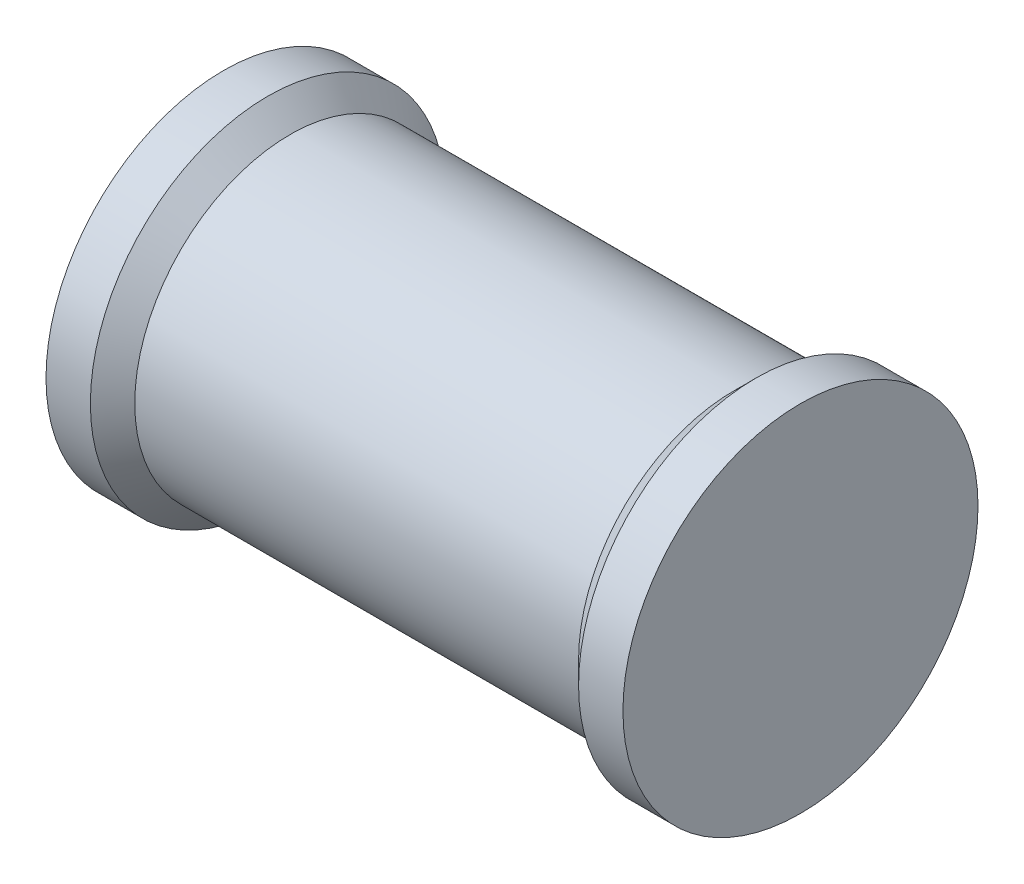
ISO-10303-21;
HEADER;
FILE_DESCRIPTION(('STEP AP214'),'2;1');
FILE_NAME('part.step','',(''),(''),'','','');
FILE_SCHEMA(('AUTOMOTIVE_DESIGN { 1 0 10303 214 1 1 1 1 }'));
ENDSEC;
DATA;
#1=APPLICATION_CONTEXT('core data for automotive mechanical design processes');
#2=APPLICATION_PROTOCOL_DEFINITION('international standard','automotive_design',2000,#1);
#3=PRODUCT_CONTEXT('',#1,'mechanical');
#4=PRODUCT('Part','Part','',(#3));
#5=PRODUCT_RELATED_PRODUCT_CATEGORY('part','',(#4));
#6=PRODUCT_DEFINITION_FORMATION('','',#4);
#7=PRODUCT_DEFINITION_CONTEXT('part definition',#1,'design');
#8=PRODUCT_DEFINITION('design','',#6,#7);
#9=PRODUCT_DEFINITION_SHAPE('','',#8);
#10=(LENGTH_UNIT() NAMED_UNIT(*) SI_UNIT(.MILLI.,.METRE.));
#11=(NAMED_UNIT(*) PLANE_ANGLE_UNIT() SI_UNIT($,.RADIAN.));
#12=(NAMED_UNIT(*) SI_UNIT($,.STERADIAN.) SOLID_ANGLE_UNIT());
#13=UNCERTAINTY_MEASURE_WITH_UNIT(LENGTH_MEASURE(1.E-05),#10,'distance_accuracy_value','');
#14=(GEOMETRIC_REPRESENTATION_CONTEXT(3) GLOBAL_UNCERTAINTY_ASSIGNED_CONTEXT((#13)) GLOBAL_UNIT_ASSIGNED_CONTEXT((#10,
#11,#12)) REPRESENTATION_CONTEXT('',''));
#15=CARTESIAN_POINT('',(0.,0.,0.));
#16=DIRECTION('',(0.,0.,1.));
#17=DIRECTION('',(1.,0.,0.));
#18=AXIS2_PLACEMENT_3D('',#15,#16,#17);
#19=CARTESIAN_POINT('',(13.,-56.8831883779294,16.9708688474058));
#20=DIRECTION('',(-1.,0.,0.));
#21=DIRECTION('',(0.,0.,1.));
#22=AXIS2_PLACEMENT_3D('',#19,#20,#21);
#23=PLANE('',#22);
#24=CARTESIAN_POINT('',(13.,-56.5345654069388,20.9556476397727));
#25=DIRECTION('',(-1.,0.,0.));
#26=DIRECTION('',(0.,0.,1.));
#27=AXIS2_PLACEMENT_3D('',#24,#25,#26);
#28=CIRCLE('',#27,2.2);
#29=CARTESIAN_POINT('',(13.,-56.5345654069388,23.1556476397727));
#30=VERTEX_POINT('',#29);
#31=EDGE_CURVE('E171',#30,#30,#28,.T.);
#32=ORIENTED_EDGE('',*,*,#31,.F.);
#33=EDGE_LOOP('',(#32));
#34=FACE_BOUND('',#33,.T.);
#35=CARTESIAN_POINT('',(13.,-56.5345654069388,20.9556476397728));
#36=DIRECTION('',(-1.,0.,0.));
#37=DIRECTION('',(0.,0.,1.));
#38=AXIS2_PLACEMENT_3D('',#35,#36,#37);
#39=CIRCLE('',#38,4.);
#40=CARTESIAN_POINT('',(13.,-56.5345654069388,24.9556476397728));
#41=VERTEX_POINT('',#40);
#42=EDGE_CURVE('E111',#41,#41,#39,.T.);
#43=ORIENTED_EDGE('',*,*,#42,.T.);
#44=EDGE_LOOP('',(#43));
#45=FACE_BOUND('',#44,.T.);
#46=ADVANCED_FACE('F41',(#34,#45),#23,.T.);
#47=CARTESIAN_POINT('',(26.,-56.5345654069388,20.9556476397728));
#48=DIRECTION('',(1.,0.,0.));
#49=DIRECTION('',(0.,0.,-1.));
#50=AXIS2_PLACEMENT_3D('',#47,#48,#49);
#51=PLANE('',#50);
#52=CARTESIAN_POINT('',(26.,-56.5345654069388,20.9556476397728));
#53=DIRECTION('',(-1.,0.,0.));
#54=DIRECTION('',(0.,0.,1.));
#55=AXIS2_PLACEMENT_3D('',#52,#53,#54);
#56=CIRCLE('',#55,4.);
#57=CARTESIAN_POINT('',(26.,-56.5345654069388,24.9556476397728));
#58=VERTEX_POINT('',#57);
#59=EDGE_CURVE('E128',#58,#58,#56,.T.);
#60=ORIENTED_EDGE('',*,*,#59,.F.);
#61=EDGE_LOOP('',(#60));
#62=FACE_BOUND('',#61,.T.);
#63=ADVANCED_FACE('F161',(#62),#51,.T.);
#64=CARTESIAN_POINT('',(13.,-56.5345654069388,20.9556476397728));
#65=DIRECTION('',(-1.,0.,0.));
#66=DIRECTION('',(0.,0.,1.));
#67=AXIS2_PLACEMENT_3D('',#64,#65,#66);
#68=CYLINDRICAL_SURFACE('',#67,4.);
#69=ORIENTED_EDGE('',*,*,#59,.T.);
#70=EDGE_LOOP('',(#69));
#71=FACE_BOUND('',#70,.T.);
#72=CARTESIAN_POINT('',(25.,-56.5345654069388,20.9556476397728));
#73=DIRECTION('',(-1.,0.,0.));
#74=DIRECTION('',(0.,0.,1.));
#75=AXIS2_PLACEMENT_3D('',#72,#73,#74);
#76=CIRCLE('',#75,4.);
#77=CARTESIAN_POINT('',(25.,-56.5345654069388,24.9556476397728));
#78=VERTEX_POINT('',#77);
#79=EDGE_CURVE('E125',#78,#78,#76,.T.);
#80=ORIENTED_EDGE('',*,*,#79,.F.);
#81=EDGE_LOOP('',(#80));
#82=FACE_BOUND('',#81,.T.);
#83=ADVANCED_FACE('F167',(#71,#82),#68,.T.);
#84=CARTESIAN_POINT('',(24.5,-56.5345654069388,20.9556476397728));
#85=DIRECTION('',(1.,0.,0.));
#86=DIRECTION('',(0.,0.,-1.));
#87=AXIS2_PLACEMENT_3D('',#84,#85,#86);
#88=CONICAL_SURFACE('',#87,3.5,0.78539816339745);
#89=ORIENTED_EDGE('',*,*,#79,.T.);
#90=EDGE_LOOP('',(#89));
#91=FACE_BOUND('',#90,.T.);
#92=CARTESIAN_POINT('',(24.5,-56.5345654069388,20.9556476397728));
#93=DIRECTION('',(-1.,0.,0.));
#94=DIRECTION('',(0.,0.,1.));
#95=AXIS2_PLACEMENT_3D('',#92,#93,#94);
#96=CIRCLE('',#95,3.5);
#97=CARTESIAN_POINT('',(24.5,-56.5345654069388,24.4556476397728));
#98=VERTEX_POINT('',#97);
#99=EDGE_CURVE('E122',#98,#98,#96,.T.);
#100=ORIENTED_EDGE('',*,*,#99,.F.);
#101=EDGE_LOOP('',(#100));
#102=FACE_BOUND('',#101,.T.);
#103=ADVANCED_FACE('F143',(#91,#102),#88,.T.);
#104=CARTESIAN_POINT('',(13.,-56.5345654069388,20.9556476397728));
#105=DIRECTION('',(-1.,0.,0.));
#106=DIRECTION('',(0.,0.,1.));
#107=AXIS2_PLACEMENT_3D('',#104,#105,#106);
#108=CYLINDRICAL_SURFACE('',#107,3.5);
#109=DIRECTION('',(-1.,0.,0.));
#110=VECTOR('',#109,1.);
#111=CARTESIAN_POINT('',(13.,-54.6865926206395,17.9832754253458));
#112=LINE('',#111,#110);
#113=CARTESIAN_POINT('',(16.9,-54.6865926206395,17.9832754253458));
#114=VERTEX_POINT('',#113);
#115=CARTESIAN_POINT('',(19.9,-54.6865926206395,17.9832754253458));
#116=VERTEX_POINT('',#115);
#117=EDGE_CURVE('E11',#114,#116,#112,.F.);
#118=ORIENTED_EDGE('',*,*,#117,.F.);
#119=CARTESIAN_POINT('',(16.9,-56.5345654069388,20.9556476397728));
#120=DIRECTION('',(-1.,0.,0.));
#121=DIRECTION('',(0.,0.,1.));
#122=AXIS2_PLACEMENT_3D('',#119,#120,#121);
#123=CIRCLE('',#122,3.5);
#124=CARTESIAN_POINT('',(16.9,-58.8706103526249,18.3493295448859));
#125=VERTEX_POINT('',#124);
#126=EDGE_CURVE('E49',#125,#114,#123,.F.);
#127=ORIENTED_EDGE('',*,*,#126,.F.);
#128=DIRECTION('',(-1.,0.,0.));
#129=VECTOR('',#128,1.);
#130=CARTESIAN_POINT('',(13.,-58.8706103526249,18.3493295448859));
#131=LINE('',#130,#129);
#132=CARTESIAN_POINT('',(19.9,-58.8706103526249,18.3493295448859));
#133=VERTEX_POINT('',#132);
#134=EDGE_CURVE('E131',#133,#125,#131,.T.);
#135=ORIENTED_EDGE('',*,*,#134,.F.);
#136=CARTESIAN_POINT('',(19.9,-56.5345654069388,20.9556476397728));
#137=DIRECTION('',(1.,0.,0.));
#138=DIRECTION('',(0.,0.,-1.));
#139=AXIS2_PLACEMENT_3D('',#136,#137,#138);
#140=CIRCLE('',#139,3.5);
#141=EDGE_CURVE('E94',#116,#133,#140,.F.);
#142=ORIENTED_EDGE('',*,*,#141,.F.);
#143=EDGE_LOOP('',(#118,#127,#135,#142));
#144=FACE_BOUND('',#143,.T.);
#145=ORIENTED_EDGE('',*,*,#99,.T.);
#146=EDGE_LOOP('',(#145));
#147=FACE_BOUND('',#146,.T.);
#148=CARTESIAN_POINT('',(14.5,-56.5345654069388,20.9556476397728));
#149=DIRECTION('',(-1.,0.,0.));
#150=DIRECTION('',(0.,0.,1.));
#151=AXIS2_PLACEMENT_3D('',#148,#149,#150);
#152=CIRCLE('',#151,3.5);
#153=CARTESIAN_POINT('',(14.5,-56.5345654069388,24.4556476397728));
#154=VERTEX_POINT('',#153);
#155=EDGE_CURVE('E119',#154,#154,#152,.T.);
#156=ORIENTED_EDGE('',*,*,#155,.F.);
#157=EDGE_LOOP('',(#156));
#158=FACE_BOUND('',#157,.T.);
#159=ADVANCED_FACE('F139',(#144,#147,#158),#108,.T.);
#160=CARTESIAN_POINT('',(14.,-56.5345654069388,20.9556476397728));
#161=DIRECTION('',(-1.,0.,0.));
#162=DIRECTION('',(0.,0.,1.));
#163=AXIS2_PLACEMENT_3D('',#160,#161,#162);
#164=CONICAL_SURFACE('',#163,4.,0.785398163397448);
#165=ORIENTED_EDGE('',*,*,#155,.T.);
#166=EDGE_LOOP('',(#165));
#167=FACE_BOUND('',#166,.T.);
#168=CARTESIAN_POINT('',(14.,-56.5345654069388,20.9556476397728));
#169=DIRECTION('',(-1.,0.,0.));
#170=DIRECTION('',(0.,0.,1.));
#171=AXIS2_PLACEMENT_3D('',#168,#169,#170);
#172=CIRCLE('',#171,4.);
#173=CARTESIAN_POINT('',(14.,-56.5345654069388,24.9556476397728));
#174=VERTEX_POINT('',#173);
#175=EDGE_CURVE('E116',#174,#174,#172,.T.);
#176=ORIENTED_EDGE('',*,*,#175,.F.);
#177=EDGE_LOOP('',(#176));
#178=FACE_BOUND('',#177,.T.);
#179=ADVANCED_FACE('F142',(#167,#178),#164,.T.);
#180=CARTESIAN_POINT('',(13.,-56.5345654069388,20.9556476397728));
#181=DIRECTION('',(-1.,0.,0.));
#182=DIRECTION('',(0.,0.,1.));
#183=AXIS2_PLACEMENT_3D('',#180,#181,#182);
#184=CYLINDRICAL_SURFACE('',#183,4.);
#185=ORIENTED_EDGE('',*,*,#175,.T.);
#186=EDGE_LOOP('',(#185));
#187=FACE_BOUND('',#186,.T.);
#188=ORIENTED_EDGE('',*,*,#42,.F.);
#189=EDGE_LOOP('',(#188));
#190=FACE_BOUND('',#189,.T.);
#191=ADVANCED_FACE('F151',(#187,#190),#184,.T.);
#192=CARTESIAN_POINT('',(16.9,-57.9290572909012,5.01653247030481));
#193=DIRECTION('',(-1.,0.,0.));
#194=DIRECTION('',(0.,0.,1.));
#195=AXIS2_PLACEMENT_3D('',#192,#193,#194);
#196=PLANE('',#195);
#197=CARTESIAN_POINT('',(16.9,-56.5345654069388,20.9556476397727));
#198=DIRECTION('',(-1.,0.,0.));
#199=DIRECTION('',(0.,0.,1.));
#200=AXIS2_PLACEMENT_3D('',#197,#198,#199);
#201=CIRCLE('',#200,1.09999999999999);
#202=CARTESIAN_POINT('',(16.9,-56.5345654069388,22.0556476397727));
#203=VERTEX_POINT('',#202);
#204=EDGE_CURVE('E97',#203,#203,#201,.T.);
#205=ORIENTED_EDGE('',*,*,#204,.T.);
#206=EDGE_LOOP('',(#205));
#207=FACE_BOUND('',#206,.T.);
#208=ORIENTED_EDGE('',*,*,#126,.T.);
#209=DIRECTION('',(0.,0.0871557427476504,0.996194698091746));
#210=VECTOR('',#209,1.);
#211=CARTESIAN_POINT('',(16.9,-55.409985285445,9.71485943118508));
#212=LINE('',#211,#210);
#213=CARTESIAN_POINT('',(16.9,-54.4425565409461,20.7726205800027));
#214=VERTEX_POINT('',#213);
#215=EDGE_CURVE('E103',#114,#214,#212,.T.);
#216=ORIENTED_EDGE('',*,*,#215,.T.);
#217=CARTESIAN_POINT('',(16.9,-56.5345654069388,20.9556476397727));
#218=DIRECTION('',(-1.,0.,0.));
#219=DIRECTION('',(0.,0.,1.));
#220=AXIS2_PLACEMENT_3D('',#217,#218,#219);
#221=CIRCLE('',#220,2.10000000000001);
#222=CARTESIAN_POINT('',(16.9,-58.6265742729314,21.1386746995428));
#223=VERTEX_POINT('',#222);
#224=EDGE_CURVE('E87',#214,#223,#221,.F.);
#225=ORIENTED_EDGE('',*,*,#224,.T.);
#226=DIRECTION('',(0.,-0.0871557427476498,-0.996194698091746));
#227=VECTOR('',#226,1.);
#228=CARTESIAN_POINT('',(16.9,-58.6265742729314,21.1386746995428));
#229=LINE('',#228,#227);
#230=EDGE_CURVE('E82',#223,#125,#229,.T.);
#231=ORIENTED_EDGE('',*,*,#230,.T.);
#232=EDGE_LOOP('',(#208,#216,#225,#231));
#233=FACE_BOUND('',#232,.T.);
#234=ADVANCED_FACE('F136',(#207,#233),#196,.F.);
#235=CARTESIAN_POINT('',(19.9,-56.5345654069388,20.9556476397727));
#236=DIRECTION('',(1.,0.,0.));
#237=DIRECTION('',(0.,0.,-1.));
#238=AXIS2_PLACEMENT_3D('',#235,#236,#237);
#239=PLANE('',#238);
#240=CARTESIAN_POINT('',(19.9,-56.5345654069388,20.9556476397727));
#241=DIRECTION('',(1.,0.,0.));
#242=DIRECTION('',(0.,0.,-1.));
#243=AXIS2_PLACEMENT_3D('',#240,#241,#242);
#244=CIRCLE('',#243,1.09999999999999);
#245=CARTESIAN_POINT('',(19.9,-56.5345654069388,19.8556476397728));
#246=VERTEX_POINT('',#245);
#247=EDGE_CURVE('E44',#246,#246,#244,.T.);
#248=ORIENTED_EDGE('',*,*,#247,.T.);
#249=EDGE_LOOP('',(#248));
#250=FACE_BOUND('',#249,.T.);
#251=ORIENTED_EDGE('',*,*,#141,.T.);
#252=DIRECTION('',(0.,-0.0871557427476498,-0.996194698091746));
#253=VECTOR('',#252,1.);
#254=CARTESIAN_POINT('',(19.9,-58.6265742729314,21.1386746995428));
#255=LINE('',#254,#253);
#256=CARTESIAN_POINT('',(19.9,-58.6265742729314,21.1386746995428));
#257=VERTEX_POINT('',#256);
#258=EDGE_CURVE('E56',#257,#133,#255,.T.);
#259=ORIENTED_EDGE('',*,*,#258,.F.);
#260=CARTESIAN_POINT('',(19.9,-56.5345654069388,20.9556476397727));
#261=DIRECTION('',(1.,0.,0.));
#262=DIRECTION('',(0.,0.,-1.));
#263=AXIS2_PLACEMENT_3D('',#260,#261,#262);
#264=CIRCLE('',#263,2.10000000000001);
#265=CARTESIAN_POINT('',(19.9,-54.4425565409461,20.7726205800027));
#266=VERTEX_POINT('',#265);
#267=EDGE_CURVE('E92',#266,#257,#264,.T.);
#268=ORIENTED_EDGE('',*,*,#267,.F.);
#269=DIRECTION('',(0.,0.0871557427476504,0.996194698091746));
#270=VECTOR('',#269,1.);
#271=CARTESIAN_POINT('',(19.9,-55.409985285445,9.71485943118508));
#272=LINE('',#271,#270);
#273=EDGE_CURVE('E96',#116,#266,#272,.T.);
#274=ORIENTED_EDGE('',*,*,#273,.F.);
#275=EDGE_LOOP('',(#251,#259,#268,#274));
#276=FACE_BOUND('',#275,.T.);
#277=ADVANCED_FACE('F91',(#250,#276),#239,.F.);
#278=CARTESIAN_POINT('',(2.49627927835047,-55.409985285445,9.71485943118508));
#279=DIRECTION('',(0.,0.996194698091746,-0.0871557427476504));
#280=DIRECTION('',(0.,0.0871557427476504,0.996194698091746));
#281=AXIS2_PLACEMENT_3D('',#278,#279,#280);
#282=PLANE('',#281);
#283=ORIENTED_EDGE('',*,*,#117,.T.);
#284=ORIENTED_EDGE('',*,*,#273,.T.);
#285=DIRECTION('',(1.,0.,0.));
#286=VECTOR('',#285,1.);
#287=CARTESIAN_POINT('',(2.49627927835047,-54.4425565409461,20.7726205800027));
#288=LINE('',#287,#286);
#289=EDGE_CURVE('E102',#214,#266,#288,.T.);
#290=ORIENTED_EDGE('',*,*,#289,.F.);
#291=ORIENTED_EDGE('',*,*,#215,.F.);
#292=EDGE_LOOP('',(#283,#284,#290,#291));
#293=FACE_BOUND('',#292,.T.);
#294=ADVANCED_FACE('F138',(#293),#282,.F.);
#295=CARTESIAN_POINT('',(2.49627927835047,-56.5345654069388,20.9556476397727));
#296=DIRECTION('',(1.,0.,0.));
#297=DIRECTION('',(0.,0.,-1.));
#298=AXIS2_PLACEMENT_3D('',#295,#296,#297);
#299=CYLINDRICAL_SURFACE('',#298,2.10000000000001);
#300=ORIENTED_EDGE('',*,*,#289,.T.);
#301=ORIENTED_EDGE('',*,*,#267,.T.);
#302=DIRECTION('',(1.,0.,0.));
#303=VECTOR('',#302,1.);
#304=CARTESIAN_POINT('',(2.49627927835047,-58.6265742729314,21.1386746995428));
#305=LINE('',#304,#303);
#306=EDGE_CURVE('E79',#223,#257,#305,.T.);
#307=ORIENTED_EDGE('',*,*,#306,.F.);
#308=ORIENTED_EDGE('',*,*,#224,.F.);
#309=EDGE_LOOP('',(#300,#301,#307,#308));
#310=FACE_BOUND('',#309,.T.);
#311=ADVANCED_FACE('F100',(#310),#299,.F.);
#312=CARTESIAN_POINT('',(2.49627927835047,-58.6265742729314,21.1386746995428));
#313=DIRECTION('',(0.,-0.996194698091746,0.0871557427476498));
#314=DIRECTION('',(0.,-0.0871557427476498,-0.996194698091746));
#315=AXIS2_PLACEMENT_3D('',#312,#313,#314);
#316=PLANE('',#315);
#317=ORIENTED_EDGE('',*,*,#134,.T.);
#318=ORIENTED_EDGE('',*,*,#230,.F.);
#319=ORIENTED_EDGE('',*,*,#306,.T.);
#320=ORIENTED_EDGE('',*,*,#258,.T.);
#321=EDGE_LOOP('',(#317,#318,#319,#320));
#322=FACE_BOUND('',#321,.T.);
#323=ADVANCED_FACE('F80',(#322),#316,.F.);
#324=CARTESIAN_POINT('',(23.,-56.5345654069388,20.9556476397727));
#325=DIRECTION('',(1.,0.,0.));
#326=DIRECTION('',(0.,0.,-1.));
#327=AXIS2_PLACEMENT_3D('',#324,#325,#326);
#328=PLANE('',#327);
#329=CARTESIAN_POINT('',(23.,-56.5345654069388,20.9556476397727));
#330=DIRECTION('',(-1.,0.,0.));
#331=DIRECTION('',(0.,0.,1.));
#332=AXIS2_PLACEMENT_3D('',#329,#330,#331);
#333=CIRCLE('',#332,1.09999999999999);
#334=CARTESIAN_POINT('',(23.,-56.5345654069388,22.0556476397727));
#335=VERTEX_POINT('',#334);
#336=EDGE_CURVE('E176',#335,#335,#333,.T.);
#337=ORIENTED_EDGE('',*,*,#336,.T.);
#338=EDGE_LOOP('',(#337));
#339=FACE_BOUND('',#338,.T.);
#340=ADVANCED_FACE('F201',(#339),#328,.F.);
#341=CARTESIAN_POINT('',(13.,-56.5345654069388,20.9556476397727));
#342=DIRECTION('',(-1.,0.,0.));
#343=DIRECTION('',(0.,0.,1.));
#344=AXIS2_PLACEMENT_3D('',#341,#342,#343);
#345=CYLINDRICAL_SURFACE('',#344,1.09999999999999);
#346=ORIENTED_EDGE('',*,*,#336,.F.);
#347=EDGE_LOOP('',(#346));
#348=FACE_BOUND('',#347,.T.);
#349=ORIENTED_EDGE('',*,*,#247,.F.);
#350=EDGE_LOOP('',(#349));
#351=FACE_BOUND('',#350,.T.);
#352=ADVANCED_FACE('F191',(#348,#351),#345,.F.);
#353=CARTESIAN_POINT('',(14.1,-56.5345654069388,20.9556476397727));
#354=DIRECTION('',(-1.,0.,0.));
#355=DIRECTION('',(0.,0.,1.));
#356=AXIS2_PLACEMENT_3D('',#353,#354,#355);
#357=CIRCLE('',#356,1.09999999999999);
#358=CARTESIAN_POINT('',(14.1,-56.5345654069388,22.0556476397727));
#359=VERTEX_POINT('',#358);
#360=EDGE_CURVE('E173',#359,#359,#357,.T.);
#361=ORIENTED_EDGE('',*,*,#360,.T.);
#362=EDGE_LOOP('',(#361));
#363=FACE_BOUND('',#362,.T.);
#364=ORIENTED_EDGE('',*,*,#204,.F.);
#365=EDGE_LOOP('',(#364));
#366=FACE_BOUND('',#365,.T.);
#367=ADVANCED_FACE('F188',(#363,#366),#345,.F.);
#368=CARTESIAN_POINT('',(13.,-56.5345654069388,20.9556476397727));
#369=DIRECTION('',(-1.,0.,0.));
#370=DIRECTION('',(0.,0.,1.));
#371=AXIS2_PLACEMENT_3D('',#368,#369,#370);
#372=CONICAL_SURFACE('',#371,2.2,0.785398163397457);
#373=ORIENTED_EDGE('',*,*,#360,.F.);
#374=EDGE_LOOP('',(#373));
#375=FACE_BOUND('',#374,.T.);
#376=ORIENTED_EDGE('',*,*,#31,.T.);
#377=EDGE_LOOP('',(#376));
#378=FACE_BOUND('',#377,.T.);
#379=ADVANCED_FACE('F190',(#375,#378),#372,.F.);
#380=CLOSED_SHELL('',(#46,#63,#83,#103,#159,#179,#191,#234,#277,#294,#311,#323,#340,#352,#367,#379));
#381=MANIFOLD_SOLID_BREP('B2',#380);
#382=ADVANCED_BREP_SHAPE_REPRESENTATION('',(#18,#381),#14);
#383=SHAPE_DEFINITION_REPRESENTATION(#9,#382);
ENDSEC;
END-ISO-10303-21;
